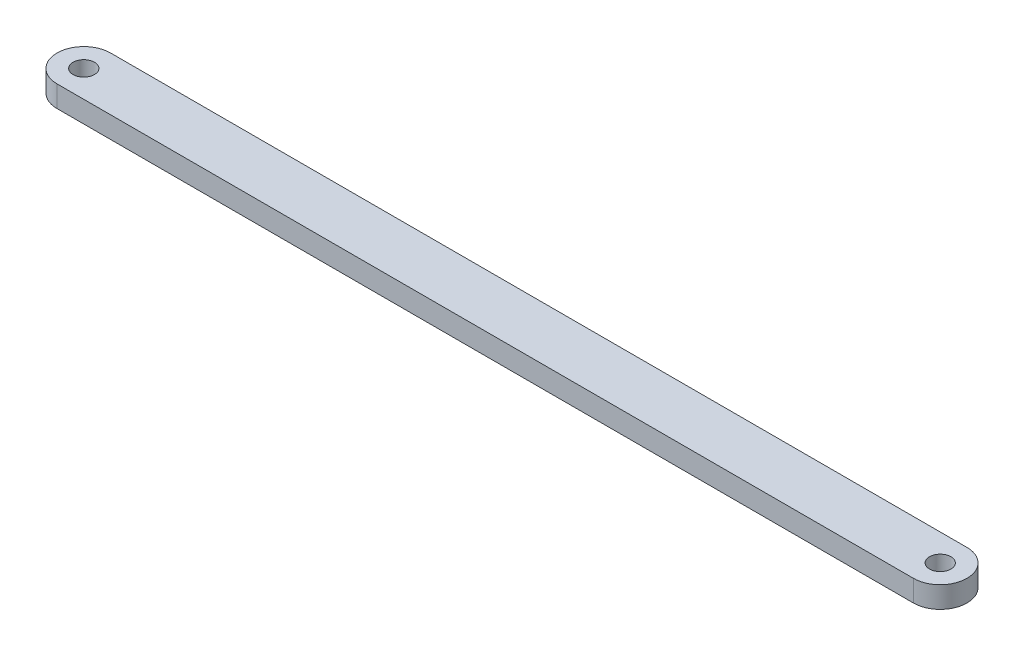
ISO-10303-21;
HEADER;
FILE_DESCRIPTION(('STEP AP214'),'2;1');
FILE_NAME('part.step','',(''),(''),'','','');
FILE_SCHEMA(('AUTOMOTIVE_DESIGN { 1 0 10303 214 1 1 1 1 }'));
ENDSEC;
DATA;
#1=APPLICATION_CONTEXT('core data for automotive mechanical design processes');
#2=APPLICATION_PROTOCOL_DEFINITION('international standard','automotive_design',2000,#1);
#3=PRODUCT_CONTEXT('',#1,'mechanical');
#4=PRODUCT('Part','Part','',(#3));
#5=PRODUCT_RELATED_PRODUCT_CATEGORY('part','',(#4));
#6=PRODUCT_DEFINITION_FORMATION('','',#4);
#7=PRODUCT_DEFINITION_CONTEXT('part definition',#1,'design');
#8=PRODUCT_DEFINITION('design','',#6,#7);
#9=PRODUCT_DEFINITION_SHAPE('','',#8);
#10=(LENGTH_UNIT() NAMED_UNIT(*) SI_UNIT(.MILLI.,.METRE.));
#11=(NAMED_UNIT(*) PLANE_ANGLE_UNIT() SI_UNIT($,.RADIAN.));
#12=(NAMED_UNIT(*) SI_UNIT($,.STERADIAN.) SOLID_ANGLE_UNIT());
#13=UNCERTAINTY_MEASURE_WITH_UNIT(LENGTH_MEASURE(1.E-05),#10,'distance_accuracy_value','');
#14=(GEOMETRIC_REPRESENTATION_CONTEXT(3) GLOBAL_UNCERTAINTY_ASSIGNED_CONTEXT((#13)) GLOBAL_UNIT_ASSIGNED_CONTEXT((#10,
#11,#12)) REPRESENTATION_CONTEXT('',''));
#15=CARTESIAN_POINT('',(0.,0.,0.));
#16=DIRECTION('',(0.,0.,1.));
#17=DIRECTION('',(1.,0.,0.));
#18=AXIS2_PLACEMENT_3D('',#15,#16,#17);
#19=CARTESIAN_POINT('',(-10.,2.,0.));
#20=DIRECTION('',(0.,1.,0.));
#21=DIRECTION('',(0.,0.,1.));
#22=AXIS2_PLACEMENT_3D('',#19,#20,#21);
#23=PLANE('',#22);
#24=CARTESIAN_POINT('',(70.,2.,0.));
#25=DIRECTION('',(0.,1.,0.));
#26=DIRECTION('',(0.,0.,1.));
#27=AXIS2_PLACEMENT_3D('',#24,#25,#26);
#28=CIRCLE('',#27,0.999999999999998);
#29=CARTESIAN_POINT('',(70.,2.,0.999999999999998));
#30=VERTEX_POINT('',#29);
#31=EDGE_CURVE('E104',#30,#30,#28,.T.);
#32=ORIENTED_EDGE('',*,*,#31,.F.);
#33=EDGE_LOOP('',(#32));
#34=FACE_BOUND('',#33,.T.);
#35=CARTESIAN_POINT('',(-10.,2.,0.));
#36=DIRECTION('',(0.,1.,0.));
#37=DIRECTION('',(0.,0.,1.));
#38=AXIS2_PLACEMENT_3D('',#35,#36,#37);
#39=CIRCLE('',#38,2.5);
#40=CARTESIAN_POINT('',(-10.,2.,-2.5));
#41=VERTEX_POINT('',#40);
#42=CARTESIAN_POINT('',(-10.,2.,2.5));
#43=VERTEX_POINT('',#42);
#44=EDGE_CURVE('E89',#41,#43,#39,.T.);
#45=ORIENTED_EDGE('',*,*,#44,.T.);
#46=DIRECTION('',(1.,0.,0.));
#47=VECTOR('',#46,1.);
#48=CARTESIAN_POINT('',(-10.,2.,2.5));
#49=LINE('',#48,#47);
#50=CARTESIAN_POINT('',(70.,2.,2.5));
#51=VERTEX_POINT('',#50);
#52=EDGE_CURVE('E84',#43,#51,#49,.T.);
#53=ORIENTED_EDGE('',*,*,#52,.T.);
#54=CARTESIAN_POINT('',(70.,2.,0.));
#55=DIRECTION('',(0.,1.,0.));
#56=DIRECTION('',(0.,0.,1.));
#57=AXIS2_PLACEMENT_3D('',#54,#55,#56);
#58=CIRCLE('',#57,2.5);
#59=CARTESIAN_POINT('',(70.,2.,-2.5));
#60=VERTEX_POINT('',#59);
#61=EDGE_CURVE('E87',#51,#60,#58,.T.);
#62=ORIENTED_EDGE('',*,*,#61,.T.);
#63=DIRECTION('',(-1.,0.,0.));
#64=VECTOR('',#63,1.);
#65=CARTESIAN_POINT('',(-10.,2.,-2.5));
#66=LINE('',#65,#64);
#67=EDGE_CURVE('E54',#60,#41,#66,.T.);
#68=ORIENTED_EDGE('',*,*,#67,.T.);
#69=EDGE_LOOP('',(#45,#53,#62,#68));
#70=FACE_BOUND('',#69,.T.);
#71=CARTESIAN_POINT('',(-10.,2.,0.));
#72=DIRECTION('',(0.,1.,0.));
#73=DIRECTION('',(0.,0.,1.));
#74=AXIS2_PLACEMENT_3D('',#71,#72,#73);
#75=CIRCLE('',#74,1.);
#76=CARTESIAN_POINT('',(-10.,2.,1.));
#77=VERTEX_POINT('',#76);
#78=EDGE_CURVE('E119',#77,#77,#75,.T.);
#79=ORIENTED_EDGE('',*,*,#78,.F.);
#80=EDGE_LOOP('',(#79));
#81=FACE_BOUND('',#80,.T.);
#82=ADVANCED_FACE('F37',(#34,#70,#81),#23,.T.);
#83=CARTESIAN_POINT('',(-10.,0.,0.));
#84=DIRECTION('',(0.,1.,0.));
#85=DIRECTION('',(0.,0.,1.));
#86=AXIS2_PLACEMENT_3D('',#83,#84,#85);
#87=PLANE('',#86);
#88=CARTESIAN_POINT('',(-10.,0.,0.));
#89=DIRECTION('',(0.,1.,0.));
#90=DIRECTION('',(0.,0.,1.));
#91=AXIS2_PLACEMENT_3D('',#88,#89,#90);
#92=CIRCLE('',#91,2.5);
#93=CARTESIAN_POINT('',(-10.,0.,-2.5));
#94=VERTEX_POINT('',#93);
#95=CARTESIAN_POINT('',(-10.,0.,2.5));
#96=VERTEX_POINT('',#95);
#97=EDGE_CURVE('E101',#94,#96,#92,.T.);
#98=ORIENTED_EDGE('',*,*,#97,.F.);
#99=DIRECTION('',(-1.,0.,0.));
#100=VECTOR('',#99,1.);
#101=CARTESIAN_POINT('',(-10.,0.,-2.5));
#102=LINE('',#101,#100);
#103=CARTESIAN_POINT('',(70.,0.,-2.5));
#104=VERTEX_POINT('',#103);
#105=EDGE_CURVE('E77',#104,#94,#102,.T.);
#106=ORIENTED_EDGE('',*,*,#105,.F.);
#107=CARTESIAN_POINT('',(70.,0.,0.));
#108=DIRECTION('',(0.,1.,0.));
#109=DIRECTION('',(0.,0.,1.));
#110=AXIS2_PLACEMENT_3D('',#107,#108,#109);
#111=CIRCLE('',#110,2.5);
#112=CARTESIAN_POINT('',(70.,0.,2.5));
#113=VERTEX_POINT('',#112);
#114=EDGE_CURVE('E71',#113,#104,#111,.T.);
#115=ORIENTED_EDGE('',*,*,#114,.F.);
#116=DIRECTION('',(1.,0.,0.));
#117=VECTOR('',#116,1.);
#118=CARTESIAN_POINT('',(-10.,0.,2.5));
#119=LINE('',#118,#117);
#120=EDGE_CURVE('E93',#96,#113,#119,.T.);
#121=ORIENTED_EDGE('',*,*,#120,.F.);
#122=EDGE_LOOP('',(#98,#106,#115,#121));
#123=FACE_BOUND('',#122,.T.);
#124=CARTESIAN_POINT('',(70.,0.,0.));
#125=DIRECTION('',(0.,1.,0.));
#126=DIRECTION('',(0.,0.,1.));
#127=AXIS2_PLACEMENT_3D('',#124,#125,#126);
#128=CIRCLE('',#127,0.999999999999998);
#129=CARTESIAN_POINT('',(70.,0.,0.999999999999998));
#130=VERTEX_POINT('',#129);
#131=EDGE_CURVE('E116',#130,#130,#128,.T.);
#132=ORIENTED_EDGE('',*,*,#131,.T.);
#133=EDGE_LOOP('',(#132));
#134=FACE_BOUND('',#133,.T.);
#135=CARTESIAN_POINT('',(-10.,0.,0.));
#136=DIRECTION('',(0.,1.,0.));
#137=DIRECTION('',(0.,0.,1.));
#138=AXIS2_PLACEMENT_3D('',#135,#136,#137);
#139=CIRCLE('',#138,1.);
#140=CARTESIAN_POINT('',(-10.,0.,1.));
#141=VERTEX_POINT('',#140);
#142=EDGE_CURVE('E122',#141,#141,#139,.T.);
#143=ORIENTED_EDGE('',*,*,#142,.T.);
#144=EDGE_LOOP('',(#143));
#145=FACE_BOUND('',#144,.T.);
#146=ADVANCED_FACE('F112',(#123,#134,#145),#87,.F.);
#147=CARTESIAN_POINT('',(-10.,2.,0.));
#148=DIRECTION('',(0.,-1.,0.));
#149=DIRECTION('',(0.,0.,-1.));
#150=AXIS2_PLACEMENT_3D('',#147,#148,#149);
#151=CYLINDRICAL_SURFACE('',#150,2.5);
#152=ORIENTED_EDGE('',*,*,#97,.T.);
#153=DIRECTION('',(0.,-1.,0.));
#154=VECTOR('',#153,1.);
#155=CARTESIAN_POINT('',(-10.,2.,2.5));
#156=LINE('',#155,#154);
#157=EDGE_CURVE('E11',#43,#96,#156,.T.);
#158=ORIENTED_EDGE('',*,*,#157,.F.);
#159=ORIENTED_EDGE('',*,*,#44,.F.);
#160=DIRECTION('',(0.,-1.,0.));
#161=VECTOR('',#160,1.);
#162=CARTESIAN_POINT('',(-10.,2.,-2.5));
#163=LINE('',#162,#161);
#164=EDGE_CURVE('E97',#41,#94,#163,.T.);
#165=ORIENTED_EDGE('',*,*,#164,.T.);
#166=EDGE_LOOP('',(#152,#158,#159,#165));
#167=FACE_BOUND('',#166,.T.);
#168=ADVANCED_FACE('F39',(#167),#151,.T.);
#169=CARTESIAN_POINT('',(-10.,2.,2.5));
#170=DIRECTION('',(0.,0.,-1.));
#171=DIRECTION('',(-1.,0.,0.));
#172=AXIS2_PLACEMENT_3D('',#169,#170,#171);
#173=PLANE('',#172);
#174=ORIENTED_EDGE('',*,*,#120,.T.);
#175=DIRECTION('',(0.,-1.,0.));
#176=VECTOR('',#175,1.);
#177=CARTESIAN_POINT('',(70.,2.,2.5));
#178=LINE('',#177,#176);
#179=EDGE_CURVE('E46',#51,#113,#178,.T.);
#180=ORIENTED_EDGE('',*,*,#179,.F.);
#181=ORIENTED_EDGE('',*,*,#52,.F.);
#182=ORIENTED_EDGE('',*,*,#157,.T.);
#183=EDGE_LOOP('',(#174,#180,#181,#182));
#184=FACE_BOUND('',#183,.T.);
#185=ADVANCED_FACE('F92',(#184),#173,.F.);
#186=CARTESIAN_POINT('',(70.,2.,0.));
#187=DIRECTION('',(0.,-1.,0.));
#188=DIRECTION('',(0.,0.,-1.));
#189=AXIS2_PLACEMENT_3D('',#186,#187,#188);
#190=CYLINDRICAL_SURFACE('',#189,2.5);
#191=ORIENTED_EDGE('',*,*,#114,.T.);
#192=DIRECTION('',(0.,-1.,0.));
#193=VECTOR('',#192,1.);
#194=CARTESIAN_POINT('',(70.,2.,-2.5));
#195=LINE('',#194,#193);
#196=EDGE_CURVE('E94',#60,#104,#195,.T.);
#197=ORIENTED_EDGE('',*,*,#196,.F.);
#198=ORIENTED_EDGE('',*,*,#61,.F.);
#199=ORIENTED_EDGE('',*,*,#179,.T.);
#200=EDGE_LOOP('',(#191,#197,#198,#199));
#201=FACE_BOUND('',#200,.T.);
#202=ADVANCED_FACE('F95',(#201),#190,.T.);
#203=CARTESIAN_POINT('',(-10.,2.,-2.5));
#204=DIRECTION('',(0.,0.,1.));
#205=DIRECTION('',(1.,0.,0.));
#206=AXIS2_PLACEMENT_3D('',#203,#204,#205);
#207=PLANE('',#206);
#208=ORIENTED_EDGE('',*,*,#105,.T.);
#209=ORIENTED_EDGE('',*,*,#164,.F.);
#210=ORIENTED_EDGE('',*,*,#67,.F.);
#211=ORIENTED_EDGE('',*,*,#196,.T.);
#212=EDGE_LOOP('',(#208,#209,#210,#211));
#213=FACE_BOUND('',#212,.T.);
#214=ADVANCED_FACE('F109',(#213),#207,.F.);
#215=CARTESIAN_POINT('',(70.,2.,0.));
#216=DIRECTION('',(0.,-1.,0.));
#217=DIRECTION('',(0.,0.,-1.));
#218=AXIS2_PLACEMENT_3D('',#215,#216,#217);
#219=CYLINDRICAL_SURFACE('',#218,0.999999999999998);
#220=ORIENTED_EDGE('',*,*,#31,.T.);
#221=EDGE_LOOP('',(#220));
#222=FACE_BOUND('',#221,.T.);
#223=ORIENTED_EDGE('',*,*,#131,.F.);
#224=EDGE_LOOP('',(#223));
#225=FACE_BOUND('',#224,.T.);
#226=ADVANCED_FACE('F139',(#222,#225),#219,.F.);
#227=CARTESIAN_POINT('',(-10.,2.,0.));
#228=DIRECTION('',(0.,-1.,0.));
#229=DIRECTION('',(0.,0.,-1.));
#230=AXIS2_PLACEMENT_3D('',#227,#228,#229);
#231=CYLINDRICAL_SURFACE('',#230,1.);
#232=ORIENTED_EDGE('',*,*,#78,.T.);
#233=EDGE_LOOP('',(#232));
#234=FACE_BOUND('',#233,.T.);
#235=ORIENTED_EDGE('',*,*,#142,.F.);
#236=EDGE_LOOP('',(#235));
#237=FACE_BOUND('',#236,.T.);
#238=ADVANCED_FACE('F128',(#234,#237),#231,.F.);
#239=CLOSED_SHELL('',(#82,#146,#168,#185,#202,#214,#226,#238));
#240=MANIFOLD_SOLID_BREP('B2',#239);
#241=ADVANCED_BREP_SHAPE_REPRESENTATION('',(#18,#240),#14);
#242=SHAPE_DEFINITION_REPRESENTATION(#9,#241);
ENDSEC;
END-ISO-10303-21;
